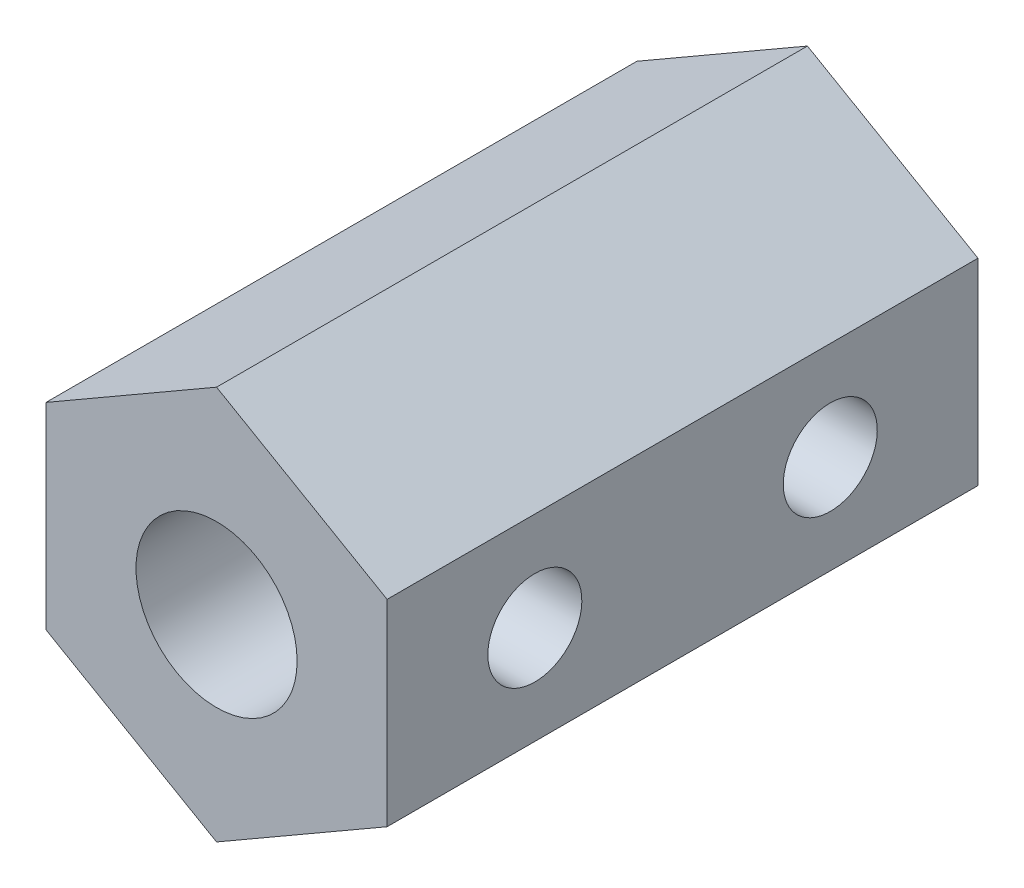
ISO-10303-21;
HEADER;
FILE_DESCRIPTION(('STEP AP214'),'2;1');
FILE_NAME('part.step','',(''),(''),'','','');
FILE_SCHEMA(('AUTOMOTIVE_DESIGN { 1 0 10303 214 1 1 1 1 }'));
ENDSEC;
DATA;
#1=APPLICATION_CONTEXT('core data for automotive mechanical design processes');
#2=APPLICATION_PROTOCOL_DEFINITION('international standard','automotive_design',2000,#1);
#3=PRODUCT_CONTEXT('',#1,'mechanical');
#4=PRODUCT('Part','Part','',(#3));
#5=PRODUCT_RELATED_PRODUCT_CATEGORY('part','',(#4));
#6=PRODUCT_DEFINITION_FORMATION('','',#4);
#7=PRODUCT_DEFINITION_CONTEXT('part definition',#1,'design');
#8=PRODUCT_DEFINITION('design','',#6,#7);
#9=PRODUCT_DEFINITION_SHAPE('','',#8);
#10=(LENGTH_UNIT() NAMED_UNIT(*) SI_UNIT(.MILLI.,.METRE.));
#11=(NAMED_UNIT(*) PLANE_ANGLE_UNIT() SI_UNIT($,.RADIAN.));
#12=(NAMED_UNIT(*) SI_UNIT($,.STERADIAN.) SOLID_ANGLE_UNIT());
#13=UNCERTAINTY_MEASURE_WITH_UNIT(LENGTH_MEASURE(1.E-05),#10,'distance_accuracy_value','');
#14=(GEOMETRIC_REPRESENTATION_CONTEXT(3) GLOBAL_UNCERTAINTY_ASSIGNED_CONTEXT((#13)) GLOBAL_UNIT_ASSIGNED_CONTEXT((#10,
#11,#12)) REPRESENTATION_CONTEXT('',''));
#15=CARTESIAN_POINT('',(0.,0.,0.));
#16=DIRECTION('',(0.,0.,1.));
#17=DIRECTION('',(1.,0.,0.));
#18=AXIS2_PLACEMENT_3D('',#15,#16,#17);
#19=CARTESIAN_POINT('',(0.,0.,22.));
#20=DIRECTION('',(0.,0.,1.));
#21=DIRECTION('',(1.,0.,0.));
#22=AXIS2_PLACEMENT_3D('',#19,#20,#21);
#23=PLANE('',#22);
#24=DIRECTION('',(-0.866025403784442,0.499999999999995,0.));
#25=VECTOR('',#24,1.);
#26=CARTESIAN_POINT('',(6.34999999999996,3.6661742093542,22.));
#27=LINE('',#26,#25);
#28=CARTESIAN_POINT('',(6.34999999999996,3.6661742093542,22.));
#29=VERTEX_POINT('',#28);
#30=CARTESIAN_POINT('',(0.,7.33234841870825,22.));
#31=VERTEX_POINT('',#30);
#32=EDGE_CURVE('E135',#29,#31,#27,.T.);
#33=ORIENTED_EDGE('',*,*,#32,.T.);
#34=DIRECTION('',(-0.866025403784438,-0.500000000000001,0.));
#35=VECTOR('',#34,1.);
#36=CARTESIAN_POINT('',(0.,7.33234841870825,22.));
#37=LINE('',#36,#35);
#38=CARTESIAN_POINT('',(-6.35000000000001,3.66617420935411,22.));
#39=VERTEX_POINT('',#38);
#40=EDGE_CURVE('E93',#31,#39,#37,.T.);
#41=ORIENTED_EDGE('',*,*,#40,.T.);
#42=DIRECTION('',(0.,-1.,0.));
#43=VECTOR('',#42,1.);
#44=CARTESIAN_POINT('',(-6.35000000000001,3.66617420935411,22.));
#45=LINE('',#44,#43);
#46=CARTESIAN_POINT('',(-6.34999999999999,-3.66617420935416,22.));
#47=VERTEX_POINT('',#46);
#48=EDGE_CURVE('E106',#39,#47,#45,.T.);
#49=ORIENTED_EDGE('',*,*,#48,.T.);
#50=DIRECTION('',(0.866025403784441,-0.499999999999995,0.));
#51=VECTOR('',#50,1.);
#52=CARTESIAN_POINT('',(-6.34999999999999,-3.66617420935416,22.));
#53=LINE('',#52,#51);
#54=CARTESIAN_POINT('',(0.,-7.33234841870825,22.));
#55=VERTEX_POINT('',#54);
#56=EDGE_CURVE('E100',#47,#55,#53,.T.);
#57=ORIENTED_EDGE('',*,*,#56,.T.);
#58=DIRECTION('',(0.866025403784435,0.500000000000007,0.));
#59=VECTOR('',#58,1.);
#60=CARTESIAN_POINT('',(0.,-7.33234841870825,22.));
#61=LINE('',#60,#59);
#62=CARTESIAN_POINT('',(6.35000000000004,-3.66617420935407,22.));
#63=VERTEX_POINT('',#62);
#64=EDGE_CURVE('E104',#55,#63,#61,.T.);
#65=ORIENTED_EDGE('',*,*,#64,.T.);
#66=DIRECTION('',(0.,1.,0.));
#67=VECTOR('',#66,1.);
#68=CARTESIAN_POINT('',(6.35000000000004,-3.66617420935407,22.));
#69=LINE('',#68,#67);
#70=EDGE_CURVE('E56',#63,#29,#69,.T.);
#71=ORIENTED_EDGE('',*,*,#70,.T.);
#72=EDGE_LOOP('',(#33,#41,#49,#57,#65,#71));
#73=FACE_BOUND('',#72,.T.);
#74=CARTESIAN_POINT('',(0.,0.,22.));
#75=DIRECTION('',(0.,0.,1.));
#76=DIRECTION('',(1.,0.,0.));
#77=AXIS2_PLACEMENT_3D('',#74,#75,#76);
#78=CIRCLE('',#77,3.);
#79=CARTESIAN_POINT('',(3.,0.,22.));
#80=VERTEX_POINT('',#79);
#81=EDGE_CURVE('E128',#80,#80,#78,.T.);
#82=ORIENTED_EDGE('',*,*,#81,.F.);
#83=EDGE_LOOP('',(#82));
#84=FACE_BOUND('',#83,.T.);
#85=ADVANCED_FACE('F33',(#73,#84),#23,.T.);
#86=CARTESIAN_POINT('',(0.,0.,0.));
#87=DIRECTION('',(0.,0.,1.));
#88=DIRECTION('',(1.,0.,0.));
#89=AXIS2_PLACEMENT_3D('',#86,#87,#88);
#90=PLANE('',#89);
#91=DIRECTION('',(-0.866025403784442,0.499999999999995,0.));
#92=VECTOR('',#91,1.);
#93=CARTESIAN_POINT('',(6.34999999999996,3.6661742093542,0.));
#94=LINE('',#93,#92);
#95=CARTESIAN_POINT('',(6.34999999999996,3.6661742093542,0.));
#96=VERTEX_POINT('',#95);
#97=CARTESIAN_POINT('',(0.,7.33234841870825,0.));
#98=VERTEX_POINT('',#97);
#99=EDGE_CURVE('E124',#96,#98,#94,.T.);
#100=ORIENTED_EDGE('',*,*,#99,.F.);
#101=DIRECTION('',(0.,1.,0.));
#102=VECTOR('',#101,1.);
#103=CARTESIAN_POINT('',(6.35000000000004,-3.66617420935407,0.));
#104=LINE('',#103,#102);
#105=CARTESIAN_POINT('',(6.35000000000004,-3.66617420935407,0.));
#106=VERTEX_POINT('',#105);
#107=EDGE_CURVE('E85',#106,#96,#104,.T.);
#108=ORIENTED_EDGE('',*,*,#107,.F.);
#109=DIRECTION('',(0.866025403784435,0.500000000000007,0.));
#110=VECTOR('',#109,1.);
#111=CARTESIAN_POINT('',(0.,-7.33234841870825,0.));
#112=LINE('',#111,#110);
#113=CARTESIAN_POINT('',(0.,-7.33234841870825,0.));
#114=VERTEX_POINT('',#113);
#115=EDGE_CURVE('E79',#114,#106,#112,.T.);
#116=ORIENTED_EDGE('',*,*,#115,.F.);
#117=DIRECTION('',(0.866025403784441,-0.499999999999995,0.));
#118=VECTOR('',#117,1.);
#119=CARTESIAN_POINT('',(-6.34999999999999,-3.66617420935416,0.));
#120=LINE('',#119,#118);
#121=CARTESIAN_POINT('',(-6.34999999999999,-3.66617420935416,0.));
#122=VERTEX_POINT('',#121);
#123=EDGE_CURVE('E114',#122,#114,#120,.T.);
#124=ORIENTED_EDGE('',*,*,#123,.F.);
#125=DIRECTION('',(0.,-1.,0.));
#126=VECTOR('',#125,1.);
#127=CARTESIAN_POINT('',(-6.35000000000001,3.66617420935411,0.));
#128=LINE('',#127,#126);
#129=CARTESIAN_POINT('',(-6.35000000000001,3.66617420935411,0.));
#130=VERTEX_POINT('',#129);
#131=EDGE_CURVE('E130',#130,#122,#128,.T.);
#132=ORIENTED_EDGE('',*,*,#131,.F.);
#133=DIRECTION('',(-0.866025403784438,-0.500000000000001,0.));
#134=VECTOR('',#133,1.);
#135=CARTESIAN_POINT('',(0.,7.33234841870825,0.));
#136=LINE('',#135,#134);
#137=EDGE_CURVE('E127',#98,#130,#136,.T.);
#138=ORIENTED_EDGE('',*,*,#137,.F.);
#139=EDGE_LOOP('',(#100,#108,#116,#124,#132,#138));
#140=FACE_BOUND('',#139,.T.);
#141=CARTESIAN_POINT('',(0.,0.,0.));
#142=DIRECTION('',(0.,0.,1.));
#143=DIRECTION('',(1.,0.,0.));
#144=AXIS2_PLACEMENT_3D('',#141,#142,#143);
#145=CIRCLE('',#144,3.);
#146=CARTESIAN_POINT('',(3.,0.,0.));
#147=VERTEX_POINT('',#146);
#148=EDGE_CURVE('E145',#147,#147,#145,.T.);
#149=ORIENTED_EDGE('',*,*,#148,.T.);
#150=EDGE_LOOP('',(#149));
#151=FACE_BOUND('',#150,.T.);
#152=ADVANCED_FACE('F163',(#140,#151),#90,.F.);
#153=CARTESIAN_POINT('',(6.34999999999996,3.6661742093542,22.));
#154=DIRECTION('',(-0.499999999999995,-0.866025403784442,0.));
#155=DIRECTION('',(0.866025403784441,-0.499999999999995,0.));
#156=AXIS2_PLACEMENT_3D('',#153,#154,#155);
#157=PLANE('',#156);
#158=ORIENTED_EDGE('',*,*,#99,.T.);
#159=DIRECTION('',(0.,0.,-1.));
#160=VECTOR('',#159,1.);
#161=CARTESIAN_POINT('',(0.,7.33234841870825,22.));
#162=LINE('',#161,#160);
#163=EDGE_CURVE('E11',#31,#98,#162,.T.);
#164=ORIENTED_EDGE('',*,*,#163,.F.);
#165=ORIENTED_EDGE('',*,*,#32,.F.);
#166=DIRECTION('',(0.,0.,-1.));
#167=VECTOR('',#166,1.);
#168=CARTESIAN_POINT('',(6.34999999999996,3.6661742093542,22.));
#169=LINE('',#168,#167);
#170=EDGE_CURVE('E120',#29,#96,#169,.T.);
#171=ORIENTED_EDGE('',*,*,#170,.T.);
#172=EDGE_LOOP('',(#158,#164,#165,#171));
#173=FACE_BOUND('',#172,.T.);
#174=ADVANCED_FACE('F35',(#173),#157,.F.);
#175=CARTESIAN_POINT('',(0.,7.33234841870825,22.));
#176=DIRECTION('',(0.500000000000001,-0.866025403784438,0.));
#177=DIRECTION('',(0.866025403784438,0.500000000000001,0.));
#178=AXIS2_PLACEMENT_3D('',#175,#176,#177);
#179=PLANE('',#178);
#180=ORIENTED_EDGE('',*,*,#137,.T.);
#181=DIRECTION('',(0.,0.,-1.));
#182=VECTOR('',#181,1.);
#183=CARTESIAN_POINT('',(-6.35000000000001,3.66617420935411,22.));
#184=LINE('',#183,#182);
#185=EDGE_CURVE('E47',#39,#130,#184,.T.);
#186=ORIENTED_EDGE('',*,*,#185,.F.);
#187=ORIENTED_EDGE('',*,*,#40,.F.);
#188=ORIENTED_EDGE('',*,*,#163,.T.);
#189=EDGE_LOOP('',(#180,#186,#187,#188));
#190=FACE_BOUND('',#189,.T.);
#191=ADVANCED_FACE('F180',(#190),#179,.F.);
#192=CARTESIAN_POINT('',(-6.35000000000001,3.66617420935411,22.));
#193=DIRECTION('',(1.,0.,0.));
#194=DIRECTION('',(0.,1.,0.));
#195=AXIS2_PLACEMENT_3D('',#192,#193,#194);
#196=PLANE('',#195);
#197=ORIENTED_EDGE('',*,*,#131,.T.);
#198=DIRECTION('',(0.,0.,-1.));
#199=VECTOR('',#198,1.);
#200=CARTESIAN_POINT('',(-6.34999999999999,-3.66617420935416,22.));
#201=LINE('',#200,#199);
#202=EDGE_CURVE('E115',#47,#122,#201,.T.);
#203=ORIENTED_EDGE('',*,*,#202,.F.);
#204=ORIENTED_EDGE('',*,*,#48,.F.);
#205=ORIENTED_EDGE('',*,*,#185,.T.);
#206=EDGE_LOOP('',(#197,#203,#204,#205));
#207=FACE_BOUND('',#206,.T.);
#208=ADVANCED_FACE('F178',(#207),#196,.F.);
#209=CARTESIAN_POINT('',(-6.34999999999999,-3.66617420935416,22.));
#210=DIRECTION('',(0.499999999999995,0.866025403784441,0.));
#211=DIRECTION('',(-0.866025403784441,0.499999999999995,0.));
#212=AXIS2_PLACEMENT_3D('',#209,#210,#211);
#213=PLANE('',#212);
#214=ORIENTED_EDGE('',*,*,#123,.T.);
#215=DIRECTION('',(0.,0.,-1.));
#216=VECTOR('',#215,1.);
#217=CARTESIAN_POINT('',(0.,-7.33234841870825,22.));
#218=LINE('',#217,#216);
#219=EDGE_CURVE('E111',#55,#114,#218,.T.);
#220=ORIENTED_EDGE('',*,*,#219,.F.);
#221=ORIENTED_EDGE('',*,*,#56,.F.);
#222=ORIENTED_EDGE('',*,*,#202,.T.);
#223=EDGE_LOOP('',(#214,#220,#221,#222));
#224=FACE_BOUND('',#223,.T.);
#225=ADVANCED_FACE('F112',(#224),#213,.F.);
#226=CARTESIAN_POINT('',(0.,-7.33234841870825,22.));
#227=DIRECTION('',(-0.500000000000007,0.866025403784435,0.));
#228=DIRECTION('',(-0.866025403784435,-0.500000000000007,0.));
#229=AXIS2_PLACEMENT_3D('',#226,#227,#228);
#230=PLANE('',#229);
#231=ORIENTED_EDGE('',*,*,#115,.T.);
#232=DIRECTION('',(0.,0.,-1.));
#233=VECTOR('',#232,1.);
#234=CARTESIAN_POINT('',(6.35000000000004,-3.66617420935407,22.));
#235=LINE('',#234,#233);
#236=EDGE_CURVE('E116',#63,#106,#235,.T.);
#237=ORIENTED_EDGE('',*,*,#236,.F.);
#238=ORIENTED_EDGE('',*,*,#64,.F.);
#239=ORIENTED_EDGE('',*,*,#219,.T.);
#240=EDGE_LOOP('',(#231,#237,#238,#239));
#241=FACE_BOUND('',#240,.T.);
#242=ADVANCED_FACE('F118',(#241),#230,.F.);
#243=CARTESIAN_POINT('',(6.35000000000004,-3.66617420935407,22.));
#244=DIRECTION('',(-1.,0.,0.));
#245=DIRECTION('',(0.,-1.,0.));
#246=AXIS2_PLACEMENT_3D('',#243,#244,#245);
#247=PLANE('',#246);
#248=CARTESIAN_POINT('',(6.35,0.,16.5));
#249=DIRECTION('',(1.,0.,0.));
#250=DIRECTION('',(0.,1.,0.));
#251=AXIS2_PLACEMENT_3D('',#248,#249,#250);
#252=CIRCLE('',#251,1.75);
#253=CARTESIAN_POINT('',(6.34999999999998,1.75000000000007,16.5));
#254=VERTEX_POINT('',#253);
#255=EDGE_CURVE('E201',#254,#254,#252,.T.);
#256=ORIENTED_EDGE('',*,*,#255,.F.);
#257=EDGE_LOOP('',(#256));
#258=FACE_BOUND('',#257,.T.);
#259=CARTESIAN_POINT('',(6.35,0.,5.5));
#260=DIRECTION('',(1.,0.,0.));
#261=DIRECTION('',(0.,1.,0.));
#262=AXIS2_PLACEMENT_3D('',#259,#260,#261);
#263=CIRCLE('',#262,1.75);
#264=CARTESIAN_POINT('',(6.34999999999998,1.75000000000007,5.5));
#265=VERTEX_POINT('',#264);
#266=EDGE_CURVE('E146',#265,#265,#263,.T.);
#267=ORIENTED_EDGE('',*,*,#266,.F.);
#268=EDGE_LOOP('',(#267));
#269=FACE_BOUND('',#268,.T.);
#270=ORIENTED_EDGE('',*,*,#107,.T.);
#271=ORIENTED_EDGE('',*,*,#170,.F.);
#272=ORIENTED_EDGE('',*,*,#70,.F.);
#273=ORIENTED_EDGE('',*,*,#236,.T.);
#274=EDGE_LOOP('',(#270,#271,#272,#273));
#275=FACE_BOUND('',#274,.T.);
#276=ADVANCED_FACE('F170',(#258,#269,#275),#247,.F.);
#277=CARTESIAN_POINT('',(0.,0.,22.));
#278=DIRECTION('',(0.,0.,-1.));
#279=DIRECTION('',(-1.,0.,0.));
#280=AXIS2_PLACEMENT_3D('',#277,#278,#279);
#281=CYLINDRICAL_SURFACE('',#280,3.);
#282=CARTESIAN_POINT('',(2.43669858620222,1.75000000000003,16.5));
#283=CARTESIAN_POINT('',(2.43669821091809,1.75000045184637,16.4113611047185));
#284=CARTESIAN_POINT('',(2.44160788460741,1.74322391194514,16.3227238943334));
#285=CARTESIAN_POINT('',(2.46040390641729,1.71658538535331,16.1483908088206));
#286=CARTESIAN_POINT('',(2.47429950740482,1.69670991020089,16.0626980615196));
#287=CARTESIAN_POINT('',(2.50886819103835,1.64515183199162,15.8971287371694));
#288=CARTESIAN_POINT('',(2.52949524548536,1.61354922075019,15.8172170416787));
#289=CARTESIAN_POINT('',(2.57511999485221,1.53968773008135,15.6638699461855));
#290=CARTESIAN_POINT('',(2.60011908828342,1.49742543895693,15.5904366298044));
#291=CARTESIAN_POINT('',(2.6551471198592,1.39777992638198,15.4428708545941));
#292=CARTESIAN_POINT('',(2.68542397458177,1.33921745197904,15.3696269495259));
#293=CARTESIAN_POINT('',(2.74560714742444,1.21105723337495,15.2332708340349));
#294=CARTESIAN_POINT('',(2.77551319609255,1.14145191954031,15.1701656336402));
#295=CARTESIAN_POINT('',(2.83514492694845,0.984713035802171,15.0496347601438));
#296=CARTESIAN_POINT('',(2.86455244924704,0.896522073845274,14.9934112475108));
#297=CARTESIAN_POINT('',(2.91640205141093,0.709891668525863,14.8970172490963));
#298=CARTESIAN_POINT('',(2.93885014282858,0.611461168794469,14.85683290002));
#299=CARTESIAN_POINT('',(2.97241689810005,0.416649273147398,14.7975604259412));
#300=CARTESIAN_POINT('',(2.98438308199891,0.320901861024351,14.7768806782808));
#301=CARTESIAN_POINT('',(2.99890385217236,0.126621897572996,14.751848297517));
#302=CARTESIAN_POINT('',(3.00146666139126,0.028091855591621,14.7474813992985));
#303=CARTESIAN_POINT('',(2.99716974401528,-0.156495068538391,14.7548563783502));
#304=CARTESIAN_POINT('',(2.99138089155147,-0.242658294594983,14.7647672886593));
#305=CARTESIAN_POINT('',(2.97281444912443,-0.411844523266108,14.7969735498551));
#306=CARTESIAN_POINT('',(2.96003634341921,-0.494867293660752,14.819269814668));
#307=CARTESIAN_POINT('',(2.92848341823655,-0.656364893028912,14.8754820877924));
#308=CARTESIAN_POINT('',(2.90966331095227,-0.734799910253141,14.9094859948441));
#309=CARTESIAN_POINT('',(2.86756375772183,-0.884967789919806,14.9878776098211));
#310=CARTESIAN_POINT('',(2.84428306099948,-0.956698764094633,15.0322682310179));
#311=CARTESIAN_POINT('',(2.79209374170038,-1.10031993041436,15.1359887503674));
#312=CARTESIAN_POINT('',(2.76284559232329,-1.17126676062858,15.1964533298607));
#313=CARTESIAN_POINT('',(2.70341339686187,-1.30259918374286,15.3276655505671));
#314=CARTESIAN_POINT('',(2.67322819817168,-1.36297110984747,15.3984262853647));
#315=CARTESIAN_POINT('',(2.61160884024912,-1.47789838153366,15.5571767463612));
#316=CARTESIAN_POINT('',(2.58038307336383,-1.53115297544717,15.6461983710236));
#317=CARTESIAN_POINT('',(2.52452387398176,-1.62161168095686,15.8339084828825));
#318=CARTESIAN_POINT('',(2.49987854748403,-1.65884482652414,15.9325790824631));
#319=CARTESIAN_POINT('',(2.46608582417188,-1.70853720110658,16.1127659909169));
#320=CARTESIAN_POINT('',(2.4546504879456,-1.72477506877109,16.1928115753789));
#321=CARTESIAN_POINT('',(2.43967272746157,-1.74590213357919,16.3550824748154));
#322=CARTESIAN_POINT('',(2.43612209475394,-1.75080313330493,16.4373054326581));
#323=CARTESIAN_POINT('',(2.43743053869139,-1.74898039241036,16.6016212032816));
#324=CARTESIAN_POINT('',(2.44229713376169,-1.74224625907732,16.6837138340859));
#325=CARTESIAN_POINT('',(2.45973523645838,-1.71753388251392,16.8453621404305));
#326=CARTESIAN_POINT('',(2.47231256709753,-1.69954714130059,16.9249158508094));
#327=CARTESIAN_POINT('',(2.50365278676386,-1.65302928692428,17.0801869976751));
#328=CARTESIAN_POINT('',(2.52245979649396,-1.62442278126805,17.1558724924044));
#329=CARTESIAN_POINT('',(2.5642256405431,-1.5576569269978,17.301648943733));
#330=CARTESIAN_POINT('',(2.58718611457638,-1.51949380330517,17.3717376750208));
#331=CARTESIAN_POINT('',(2.63944389498439,-1.42709875316825,17.5171188563031));
#332=CARTESIAN_POINT('',(2.66915133905923,-1.37123101284255,17.5912263899248));
#333=CARTESIAN_POINT('',(2.72870860976122,-1.2485224097003,17.7297415156961));
#334=CARTESIAN_POINT('',(2.75855853948195,-1.18167183667124,17.7941404266979));
#335=CARTESIAN_POINT('',(2.81899071549213,-1.029892560434,17.9186237055379));
#336=CARTESIAN_POINT('',(2.84928138906161,-0.943778122538557,17.9774196858398));
#337=CARTESIAN_POINT('',(2.90346015966261,-0.760910913608822,18.0793818001881));
#338=CARTESIAN_POINT('',(2.92735304610789,-0.664166177419373,18.1225596345963));
#339=CARTESIAN_POINT('',(2.9643532208793,-0.47067402489655,18.1883628925836));
#340=CARTESIAN_POINT('',(2.97815986600772,-0.374522814239365,18.2123354536865));
#341=CARTESIAN_POINT('',(2.9962804721505,-0.178706533702722,18.2436647397335));
#342=CARTESIAN_POINT('',(3.00060375186925,-0.0790450111450896,18.2510377761703));
#343=CARTESIAN_POINT('',(2.99934002716751,0.107655929988343,18.2488661823514));
#344=CARTESIAN_POINT('',(2.99491069180817,0.194734538061922,18.2412978970827));
#345=CARTESIAN_POINT('',(2.97881697494109,0.366137785941645,18.2134701466853));
#346=CARTESIAN_POINT('',(2.96715232205176,0.450462322323451,18.1932102055189));
#347=CARTESIAN_POINT('',(2.93771241495244,0.613761582363609,18.141070466725));
#348=CARTESIAN_POINT('',(2.91996949045702,0.692762016439806,18.1092520942239));
#349=CARTESIAN_POINT('',(2.87979165338306,0.844368647802343,18.0351444018639));
#350=CARTESIAN_POINT('',(2.85735556459278,0.916973235651978,17.9928524566044));
#351=CARTESIAN_POINT('',(2.80678961708282,1.06230015031836,17.8937651338791));
#352=CARTESIAN_POINT('',(2.77830505779608,1.13415977100249,17.8358870507758));
#353=CARTESIAN_POINT('',(2.71996380471867,1.26772272997669,17.7098860102852));
#354=CARTESIAN_POINT('',(2.69010552501784,1.32941393272298,17.6417509945418));
#355=CARTESIAN_POINT('',(2.62832782018946,1.4480520863921,17.4879891095944));
#356=CARTESIAN_POINT('',(2.59656217758449,1.50365362198235,17.4012533588189));
#357=CARTESIAN_POINT('',(2.53876100901197,1.59932168084085,17.2178650254964));
#358=CARTESIAN_POINT('',(2.51271845895713,1.63940729371892,17.1212248150765));
#359=CARTESIAN_POINT('',(2.47435095867368,1.69663483894559,16.9376203962233));
#360=CARTESIAN_POINT('',(2.46043560953242,1.71653991344379,16.8518579447994));
#361=CARTESIAN_POINT('',(2.44161571370902,1.74321337060435,16.67739366802));
#362=CARTESIAN_POINT('',(2.43669896172809,1.74999954786263,16.5886959904762));
#363=CARTESIAN_POINT('',(2.43669858620222,1.75000000000003,16.5));
#364=B_SPLINE_CURVE_WITH_KNOTS('',3,(#282,#283,#284,#285,#286,#287,#288,#289,#290,#291,#292,
#293,#294,#295,#296,#297,#298,#299,#300,#301,#302,#303,#304,#305,#306,#307,#308,#309,#310,#311,
#312,#313,#314,#315,#316,#317,#318,#319,#320,#321,#322,#323,#324,#325,#326,#327,#328,#329,#330,
#331,#332,#333,#334,#335,#336,#337,#338,#339,#340,#341,#342,#343,#344,#345,#346,#347,#348,#349,
#350,#351,#352,#353,#354,#355,#356,#357,#358,#359,#360,#361,#362,#363),.UNSPECIFIED.,.T.,.F.,(4,
2,2,2,2,2,2,2,2,2,2,2,2,2,2,2,2,2,2,2,2,2,2,2,2,2,2,2,2,2,2,2,2,2,2,2,2,2,2,2,4),(0.,
0.265545218763686,0.531364307474163,0.795402587763074,1.0595254826214,1.35398659107803,
1.64865042554404,1.97283142487701,2.29673161156482,2.5910478996181,2.88510675625999,
3.14464340280145,3.40419920332162,3.66574779852172,3.9273698411442,4.21928633023893,
4.51157734664539,4.83494305243835,5.15772026336277,5.40406403188873,5.6501512212884,
5.89645833389886,6.14295168285401,6.39122950133277,6.63960555026168,6.93078691809872,
7.22222712635785,7.54626723053992,7.87006407425509,8.16844648867916,8.46653556995421,
8.7278211433688,8.98911651764959,9.2490431284122,9.50903496080327,9.79757898950317,
10.0864649272873,10.4083273312523,10.7297924718896,10.9958699008298,11.2615861659037),.UNSPECIFIED.);
#365=CARTESIAN_POINT('',(2.43669858620222,1.75000000000003,16.5));
#366=VERTEX_POINT('',#365);
#367=EDGE_CURVE('E37',#366,#366,#364,.T.);
#368=ORIENTED_EDGE('',*,*,#367,.F.);
#369=EDGE_LOOP('',(#368));
#370=FACE_BOUND('',#369,.T.);
#371=CARTESIAN_POINT('',(2.43669858620222,1.75000000000003,5.5));
#372=CARTESIAN_POINT('',(2.4366982109181,1.75000045184637,5.41136110471854));
#373=CARTESIAN_POINT('',(2.44160788460741,1.74322391194514,5.32272389433345));
#374=CARTESIAN_POINT('',(2.46040390641729,1.71658538535331,5.14839080882064));
#375=CARTESIAN_POINT('',(2.47429950740482,1.69670991020089,5.06269806151959));
#376=CARTESIAN_POINT('',(2.50886819103835,1.64515183199162,4.89712873716944));
#377=CARTESIAN_POINT('',(2.52949524548536,1.61354922075019,4.81721704167874));
#378=CARTESIAN_POINT('',(2.57511999485221,1.53968773008135,4.66386994618549));
#379=CARTESIAN_POINT('',(2.60011908828342,1.49742543895693,4.59043662980441));
#380=CARTESIAN_POINT('',(2.6551471198592,1.39777992638198,4.44287085459414));
#381=CARTESIAN_POINT('',(2.68542397458176,1.33921745197904,4.36962694952593));
#382=CARTESIAN_POINT('',(2.74560714742444,1.21105723337495,4.23327083403489));
#383=CARTESIAN_POINT('',(2.77551319609255,1.14145191954031,4.17016563364018));
#384=CARTESIAN_POINT('',(2.83514492694846,0.984713035802171,4.04963476014383));
#385=CARTESIAN_POINT('',(2.86455244924704,0.896522073845274,3.99341124751077));
#386=CARTESIAN_POINT('',(2.91640205141093,0.709891668525863,3.89701724909628));
#387=CARTESIAN_POINT('',(2.93885014282858,0.611461168794469,3.85683290001997));
#388=CARTESIAN_POINT('',(2.97241689810005,0.416649273147397,3.79756042594118));
#389=CARTESIAN_POINT('',(2.98438308199891,0.32090186102435,3.77688067828079));
#390=CARTESIAN_POINT('',(2.99890385217236,0.126621897572995,3.75184829751699));
#391=CARTESIAN_POINT('',(3.00146666139126,0.0280918555916199,3.74748139929854));
#392=CARTESIAN_POINT('',(2.99716974401528,-0.156495068538392,3.75485637835022));
#393=CARTESIAN_POINT('',(2.99138089155147,-0.242658294594984,3.7647672886593));
#394=CARTESIAN_POINT('',(2.97281444912443,-0.411844523266109,3.79697354985515));
#395=CARTESIAN_POINT('',(2.96003634341921,-0.494867293660753,3.81926981466797));
#396=CARTESIAN_POINT('',(2.92848341823655,-0.656364893028913,3.87548208779237));
#397=CARTESIAN_POINT('',(2.90966331095227,-0.734799910253142,3.9094859948441));
#398=CARTESIAN_POINT('',(2.86756375772183,-0.884967789919807,3.98787760982114));
#399=CARTESIAN_POINT('',(2.84428306099948,-0.956698764094634,4.03226823101793));
#400=CARTESIAN_POINT('',(2.79209374170038,-1.10031993041436,4.13598875036744));
#401=CARTESIAN_POINT('',(2.76284559232329,-1.17126676062858,4.1964533298607));
#402=CARTESIAN_POINT('',(2.70341339686187,-1.30259918374287,4.32766555056707));
#403=CARTESIAN_POINT('',(2.67322819817168,-1.36297110984747,4.39842628536472));
#404=CARTESIAN_POINT('',(2.61160884024912,-1.47789838153366,4.55717674636124));
#405=CARTESIAN_POINT('',(2.58038307336383,-1.53115297544718,4.64619837102356));
#406=CARTESIAN_POINT('',(2.52452387398176,-1.62161168095686,4.83390848288251));
#407=CARTESIAN_POINT('',(2.49987854748403,-1.65884482652414,4.93257908246313));
#408=CARTESIAN_POINT('',(2.46608582417188,-1.70853720110658,5.11276599091687));
#409=CARTESIAN_POINT('',(2.4546504879456,-1.72477506877109,5.19281157537891));
#410=CARTESIAN_POINT('',(2.43967272746157,-1.74590213357919,5.35508247481538));
#411=CARTESIAN_POINT('',(2.43612209475394,-1.75080313330493,5.4373054326581));
#412=CARTESIAN_POINT('',(2.43743053869139,-1.74898039241036,5.60162120328162));
#413=CARTESIAN_POINT('',(2.44229713376169,-1.74224625907732,5.68371383408586));
#414=CARTESIAN_POINT('',(2.45973523645838,-1.71753388251392,5.84536214043046));
#415=CARTESIAN_POINT('',(2.47231256709753,-1.69954714130059,5.92491585080942));
#416=CARTESIAN_POINT('',(2.50365278676386,-1.65302928692428,6.08018699767512));
#417=CARTESIAN_POINT('',(2.52245979649396,-1.62442278126805,6.15587249240443));
#418=CARTESIAN_POINT('',(2.5642256405431,-1.5576569269978,6.301648943733));
#419=CARTESIAN_POINT('',(2.58718611457638,-1.51949380330517,6.37173767502076));
#420=CARTESIAN_POINT('',(2.63944389498439,-1.42709875316825,6.51711885630312));
#421=CARTESIAN_POINT('',(2.66915133905922,-1.37123101284255,6.59122638992483));
#422=CARTESIAN_POINT('',(2.72870860976122,-1.24852240970031,6.72974151569608));
#423=CARTESIAN_POINT('',(2.75855853948195,-1.18167183667124,6.79414042669792));
#424=CARTESIAN_POINT('',(2.81899071549213,-1.02989256043401,6.91862370553789));
#425=CARTESIAN_POINT('',(2.8492813890616,-0.943778122538562,6.9774196858398));
#426=CARTESIAN_POINT('',(2.90346015966261,-0.760910913608829,7.0793818001881));
#427=CARTESIAN_POINT('',(2.92735304610789,-0.66416617741938,7.12255963459634));
#428=CARTESIAN_POINT('',(2.9643532208793,-0.470674024896558,7.18836289258356));
#429=CARTESIAN_POINT('',(2.97815986600772,-0.374522814239372,7.21233545368651));
#430=CARTESIAN_POINT('',(2.9962804721505,-0.178706533702729,7.24366473973351));
#431=CARTESIAN_POINT('',(3.00060375186925,-0.079045011145097,7.25103777617032));
#432=CARTESIAN_POINT('',(2.99934002716751,0.107655929988336,7.24886618235141));
#433=CARTESIAN_POINT('',(2.99491069180817,0.194734538061915,7.24129789708268));
#434=CARTESIAN_POINT('',(2.97881697494109,0.366137785941638,7.21347014668527));
#435=CARTESIAN_POINT('',(2.96715232205176,0.450462322323444,7.19321020551892));
#436=CARTESIAN_POINT('',(2.93771241495244,0.613761582363603,7.14107046672505));
#437=CARTESIAN_POINT('',(2.91996949045702,0.692762016439802,7.10925209422388));
#438=CARTESIAN_POINT('',(2.87979165338306,0.844368647802339,7.03514440186392));
#439=CARTESIAN_POINT('',(2.85735556459278,0.916973235651973,6.99285245660441));
#440=CARTESIAN_POINT('',(2.80678961708283,1.06230015031835,6.89376513387913));
#441=CARTESIAN_POINT('',(2.77830505779608,1.13415977100249,6.83588705077582));
#442=CARTESIAN_POINT('',(2.71996380471867,1.26772272997668,6.70988601028518));
#443=CARTESIAN_POINT('',(2.69010552501784,1.32941393272297,6.64175099454178));
#444=CARTESIAN_POINT('',(2.62832782018946,1.4480520863921,6.48798910959444));
#445=CARTESIAN_POINT('',(2.5965621775845,1.50365362198234,6.4012533588189));
#446=CARTESIAN_POINT('',(2.53876100901198,1.59932168084085,6.21786502549639));
#447=CARTESIAN_POINT('',(2.51271845895713,1.63940729371892,6.12122481507649));
#448=CARTESIAN_POINT('',(2.47435095867369,1.69663483894559,5.93762039622329));
#449=CARTESIAN_POINT('',(2.46043560953242,1.71653991344379,5.85185794479939));
#450=CARTESIAN_POINT('',(2.44161571370902,1.74321337060435,5.67739366802005));
#451=CARTESIAN_POINT('',(2.43669896172809,1.74999954786263,5.5886959904762));
#452=CARTESIAN_POINT('',(2.43669858620222,1.75000000000003,5.5));
#453=B_SPLINE_CURVE_WITH_KNOTS('',3,(#371,#372,#373,#374,#375,#376,#377,#378,#379,#380,#381,
#382,#383,#384,#385,#386,#387,#388,#389,#390,#391,#392,#393,#394,#395,#396,#397,#398,#399,#400,
#401,#402,#403,#404,#405,#406,#407,#408,#409,#410,#411,#412,#413,#414,#415,#416,#417,#418,#419,
#420,#421,#422,#423,#424,#425,#426,#427,#428,#429,#430,#431,#432,#433,#434,#435,#436,#437,#438,
#439,#440,#441,#442,#443,#444,#445,#446,#447,#448,#449,#450,#451,#452),.UNSPECIFIED.,.T.,.F.,(4,
2,2,2,2,2,2,2,2,2,2,2,2,2,2,2,2,2,2,2,2,2,2,2,2,2,2,2,2,2,2,2,2,2,2,2,2,2,2,2,4),(0.,
0.265545218763684,0.531364307474163,0.795402587763073,1.05952548262139,1.35398659107802,
1.64865042554404,1.97283142487701,2.29673161156483,2.5910478996181,2.88510675625999,
3.14464340280145,3.40419920332162,3.66574779852172,3.9273698411442,4.21928633023893,
4.5115773466454,4.83494305243835,5.15772026336277,5.40406403188873,5.65015122128839,
5.89645833389886,6.142951682854,6.39122950133275,6.63960555026167,6.93078691809871,
7.22222712635785,7.54626723053991,7.87006407425509,8.16844648867916,8.46653556995421,
8.7278211433688,8.98911651764958,9.2490431284122,9.50903496080327,9.79757898950316,
10.0864649272872,10.4083273312523,10.7297924718895,10.9958699008298,11.2615861659037),.UNSPECIFIED.);
#454=CARTESIAN_POINT('',(2.43669858620222,1.75000000000003,5.5));
#455=VERTEX_POINT('',#454);
#456=EDGE_CURVE('E140',#455,#455,#453,.T.);
#457=ORIENTED_EDGE('',*,*,#456,.F.);
#458=EDGE_LOOP('',(#457));
#459=FACE_BOUND('',#458,.T.);
#460=ORIENTED_EDGE('',*,*,#81,.T.);
#461=EDGE_LOOP('',(#460));
#462=FACE_BOUND('',#461,.T.);
#463=ORIENTED_EDGE('',*,*,#148,.F.);
#464=EDGE_LOOP('',(#463));
#465=FACE_BOUND('',#464,.T.);
#466=ADVANCED_FACE('F147',(#370,#459,#462,#465),#281,.F.);
#467=CARTESIAN_POINT('',(1.85,0.,5.5));
#468=DIRECTION('',(1.,0.,0.));
#469=DIRECTION('',(0.,1.,0.));
#470=AXIS2_PLACEMENT_3D('',#467,#468,#469);
#471=CYLINDRICAL_SURFACE('',#470,1.75);
#472=ORIENTED_EDGE('',*,*,#456,.T.);
#473=EDGE_LOOP('',(#472));
#474=FACE_BOUND('',#473,.T.);
#475=ORIENTED_EDGE('',*,*,#266,.T.);
#476=EDGE_LOOP('',(#475));
#477=FACE_BOUND('',#476,.T.);
#478=ADVANCED_FACE('F150',(#474,#477),#471,.F.);
#479=CARTESIAN_POINT('',(1.85,0.,16.5));
#480=DIRECTION('',(1.,0.,0.));
#481=DIRECTION('',(0.,1.,0.));
#482=AXIS2_PLACEMENT_3D('',#479,#480,#481);
#483=CYLINDRICAL_SURFACE('',#482,1.75);
#484=ORIENTED_EDGE('',*,*,#367,.T.);
#485=EDGE_LOOP('',(#484));
#486=FACE_BOUND('',#485,.T.);
#487=ORIENTED_EDGE('',*,*,#255,.T.);
#488=EDGE_LOOP('',(#487));
#489=FACE_BOUND('',#488,.T.);
#490=ADVANCED_FACE('F153',(#486,#489),#483,.F.);
#491=CLOSED_SHELL('',(#85,#152,#174,#191,#208,#225,#242,#276,#466,#478,#490));
#492=MANIFOLD_SOLID_BREP('B2',#491);
#493=ADVANCED_BREP_SHAPE_REPRESENTATION('',(#18,#492),#14);
#494=SHAPE_DEFINITION_REPRESENTATION(#9,#493);
ENDSEC;
END-ISO-10303-21;
